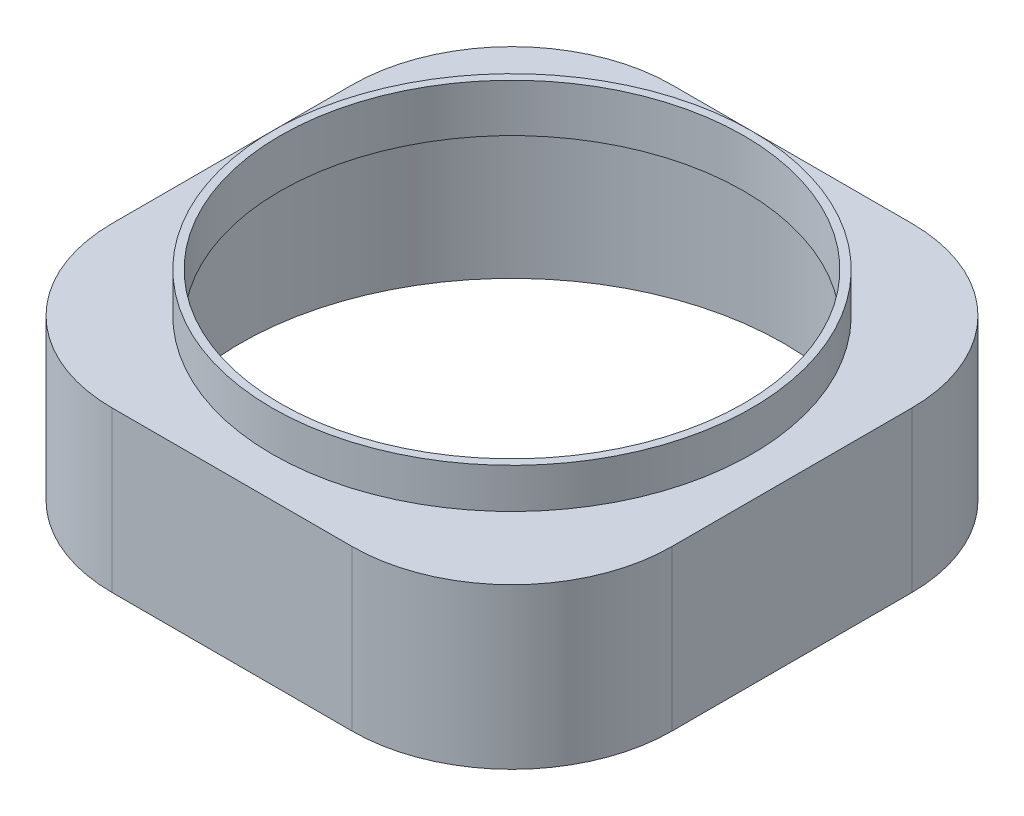
ISO-10303-21;
HEADER;
FILE_DESCRIPTION(('STEP AP214'),'2;1');
FILE_NAME('part.step','',(''),(''),'','','');
FILE_SCHEMA(('AUTOMOTIVE_DESIGN { 1 0 10303 214 1 1 1 1 }'));
ENDSEC;
DATA;
#1=APPLICATION_CONTEXT('core data for automotive mechanical design processes');
#2=APPLICATION_PROTOCOL_DEFINITION('international standard','automotive_design',2000,#1);
#3=PRODUCT_CONTEXT('',#1,'mechanical');
#4=PRODUCT('Part','Part','',(#3));
#5=PRODUCT_RELATED_PRODUCT_CATEGORY('part','',(#4));
#6=PRODUCT_DEFINITION_FORMATION('','',#4);
#7=PRODUCT_DEFINITION_CONTEXT('part definition',#1,'design');
#8=PRODUCT_DEFINITION('design','',#6,#7);
#9=PRODUCT_DEFINITION_SHAPE('','',#8);
#10=(LENGTH_UNIT() NAMED_UNIT(*) SI_UNIT(.MILLI.,.METRE.));
#11=(NAMED_UNIT(*) PLANE_ANGLE_UNIT() SI_UNIT($,.RADIAN.));
#12=(NAMED_UNIT(*) SI_UNIT($,.STERADIAN.) SOLID_ANGLE_UNIT());
#13=UNCERTAINTY_MEASURE_WITH_UNIT(LENGTH_MEASURE(1.E-05),#10,'distance_accuracy_value','');
#14=(GEOMETRIC_REPRESENTATION_CONTEXT(3) GLOBAL_UNCERTAINTY_ASSIGNED_CONTEXT((#13)) GLOBAL_UNIT_ASSIGNED_CONTEXT((#10,
#11,#12)) REPRESENTATION_CONTEXT('',''));
#15=CARTESIAN_POINT('',(0.,0.,0.));
#16=DIRECTION('',(0.,0.,1.));
#17=DIRECTION('',(1.,0.,0.));
#18=AXIS2_PLACEMENT_3D('',#15,#16,#17);
#19=CARTESIAN_POINT('',(-30.,-40.,30.));
#20=DIRECTION('',(0.,1.,0.));
#21=DIRECTION('',(0.,0.,1.));
#22=AXIS2_PLACEMENT_3D('',#19,#20,#21);
#23=CYLINDRICAL_SURFACE('',#22,40.);
#24=CARTESIAN_POINT('',(-30.,0.,30.));
#25=DIRECTION('',(0.,1.,0.));
#26=DIRECTION('',(0.,0.,-1.));
#27=AXIS2_PLACEMENT_3D('',#24,#25,#26);
#28=CIRCLE('',#27,40.);
#29=CARTESIAN_POINT('',(-70.,0.,29.9999999999997));
#30=VERTEX_POINT('',#29);
#31=CARTESIAN_POINT('',(-29.9999999999997,0.,70.));
#32=VERTEX_POINT('',#31);
#33=EDGE_CURVE('E132',#30,#32,#28,.T.);
#34=ORIENTED_EDGE('',*,*,#33,.F.);
#35=DIRECTION('',(0.,1.,0.));
#36=VECTOR('',#35,1.);
#37=CARTESIAN_POINT('',(-70.,-40.,29.9999999999997));
#38=LINE('',#37,#36);
#39=CARTESIAN_POINT('',(-70.,-40.,29.9999999999997));
#40=VERTEX_POINT('',#39);
#41=EDGE_CURVE('E42',#40,#30,#38,.T.);
#42=ORIENTED_EDGE('',*,*,#41,.F.);
#43=CARTESIAN_POINT('',(-30.,-40.,30.));
#44=DIRECTION('',(0.,1.,0.));
#45=DIRECTION('',(0.,0.,-1.));
#46=AXIS2_PLACEMENT_3D('',#43,#44,#45);
#47=CIRCLE('',#46,40.);
#48=CARTESIAN_POINT('',(-29.9999999999997,-40.,70.));
#49=VERTEX_POINT('',#48);
#50=EDGE_CURVE('E154',#40,#49,#47,.T.);
#51=ORIENTED_EDGE('',*,*,#50,.T.);
#52=DIRECTION('',(0.,1.,0.));
#53=VECTOR('',#52,1.);
#54=CARTESIAN_POINT('',(-29.9999999999997,-40.,70.));
#55=LINE('',#54,#53);
#56=EDGE_CURVE('E36',#49,#32,#55,.T.);
#57=ORIENTED_EDGE('',*,*,#56,.T.);
#58=EDGE_LOOP('',(#34,#42,#51,#57));
#59=FACE_BOUND('',#58,.T.);
#60=ADVANCED_FACE('F33',(#59),#23,.T.);
#61=CARTESIAN_POINT('',(-70.,-40.,-29.9999999999997));
#62=DIRECTION('',(-1.,0.,0.));
#63=DIRECTION('',(0.,0.,1.));
#64=AXIS2_PLACEMENT_3D('',#61,#62,#63);
#65=PLANE('',#64);
#66=DIRECTION('',(0.,0.,1.));
#67=VECTOR('',#66,1.);
#68=CARTESIAN_POINT('',(-70.,0.,-29.9999999999997));
#69=LINE('',#68,#67);
#70=CARTESIAN_POINT('',(-70.,0.,-29.9999999999997));
#71=VERTEX_POINT('',#70);
#72=EDGE_CURVE('E151',#71,#30,#69,.T.);
#73=ORIENTED_EDGE('',*,*,#72,.F.);
#74=DIRECTION('',(0.,1.,0.));
#75=VECTOR('',#74,1.);
#76=CARTESIAN_POINT('',(-70.,-40.,-29.9999999999997));
#77=LINE('',#76,#75);
#78=CARTESIAN_POINT('',(-70.,-40.,-29.9999999999997));
#79=VERTEX_POINT('',#78);
#80=EDGE_CURVE('E79',#79,#71,#77,.T.);
#81=ORIENTED_EDGE('',*,*,#80,.F.);
#82=DIRECTION('',(0.,0.,1.));
#83=VECTOR('',#82,1.);
#84=CARTESIAN_POINT('',(-70.,-40.,-29.9999999999997));
#85=LINE('',#84,#83);
#86=EDGE_CURVE('E122',#79,#40,#85,.T.);
#87=ORIENTED_EDGE('',*,*,#86,.T.);
#88=ORIENTED_EDGE('',*,*,#41,.T.);
#89=EDGE_LOOP('',(#73,#81,#87,#88));
#90=FACE_BOUND('',#89,.T.);
#91=ADVANCED_FACE('F166',(#90),#65,.T.);
#92=CARTESIAN_POINT('',(-30.,-40.,-30.));
#93=DIRECTION('',(0.,1.,0.));
#94=DIRECTION('',(0.,0.,1.));
#95=AXIS2_PLACEMENT_3D('',#92,#93,#94);
#96=CYLINDRICAL_SURFACE('',#95,40.);
#97=CARTESIAN_POINT('',(-30.,0.,-30.));
#98=DIRECTION('',(0.,1.,0.));
#99=DIRECTION('',(0.,0.,-1.));
#100=AXIS2_PLACEMENT_3D('',#97,#98,#99);
#101=CIRCLE('',#100,40.);
#102=CARTESIAN_POINT('',(-29.9999999999997,0.,-70.));
#103=VERTEX_POINT('',#102);
#104=EDGE_CURVE('E109',#103,#71,#101,.T.);
#105=ORIENTED_EDGE('',*,*,#104,.F.);
#106=DIRECTION('',(0.,1.,0.));
#107=VECTOR('',#106,1.);
#108=CARTESIAN_POINT('',(-29.9999999999997,-40.,-70.));
#109=LINE('',#108,#107);
#110=CARTESIAN_POINT('',(-29.9999999999997,-40.,-70.));
#111=VERTEX_POINT('',#110);
#112=EDGE_CURVE('E104',#111,#103,#109,.T.);
#113=ORIENTED_EDGE('',*,*,#112,.F.);
#114=CARTESIAN_POINT('',(-30.,-40.,-30.));
#115=DIRECTION('',(0.,1.,0.));
#116=DIRECTION('',(0.,0.,-1.));
#117=AXIS2_PLACEMENT_3D('',#114,#115,#116);
#118=CIRCLE('',#117,40.);
#119=EDGE_CURVE('E107',#111,#79,#118,.T.);
#120=ORIENTED_EDGE('',*,*,#119,.T.);
#121=ORIENTED_EDGE('',*,*,#80,.T.);
#122=EDGE_LOOP('',(#105,#113,#120,#121));
#123=FACE_BOUND('',#122,.T.);
#124=ADVANCED_FACE('F106',(#123),#96,.T.);
#125=CARTESIAN_POINT('',(-29.9999999999997,-40.,-70.));
#126=DIRECTION('',(0.,0.,-1.));
#127=DIRECTION('',(-1.,0.,0.));
#128=AXIS2_PLACEMENT_3D('',#125,#126,#127);
#129=PLANE('',#128);
#130=DIRECTION('',(-1.,0.,0.));
#131=VECTOR('',#130,1.);
#132=CARTESIAN_POINT('',(-29.9999999999997,0.,-70.));
#133=LINE('',#132,#131);
#134=CARTESIAN_POINT('',(29.9999999999997,0.,-70.));
#135=VERTEX_POINT('',#134);
#136=EDGE_CURVE('E148',#135,#103,#133,.T.);
#137=ORIENTED_EDGE('',*,*,#136,.F.);
#138=DIRECTION('',(0.,1.,0.));
#139=VECTOR('',#138,1.);
#140=CARTESIAN_POINT('',(29.9999999999997,-40.,-70.));
#141=LINE('',#140,#139);
#142=CARTESIAN_POINT('',(29.9999999999997,-40.,-70.));
#143=VERTEX_POINT('',#142);
#144=EDGE_CURVE('E114',#143,#135,#141,.T.);
#145=ORIENTED_EDGE('',*,*,#144,.F.);
#146=DIRECTION('',(-1.,0.,0.));
#147=VECTOR('',#146,1.);
#148=CARTESIAN_POINT('',(-29.9999999999997,-40.,-70.));
#149=LINE('',#148,#147);
#150=EDGE_CURVE('E120',#143,#111,#149,.T.);
#151=ORIENTED_EDGE('',*,*,#150,.T.);
#152=ORIENTED_EDGE('',*,*,#112,.T.);
#153=EDGE_LOOP('',(#137,#145,#151,#152));
#154=FACE_BOUND('',#153,.T.);
#155=ADVANCED_FACE('F124',(#154),#129,.T.);
#156=CARTESIAN_POINT('',(30.,-40.,-30.));
#157=DIRECTION('',(0.,1.,0.));
#158=DIRECTION('',(0.,0.,1.));
#159=AXIS2_PLACEMENT_3D('',#156,#157,#158);
#160=CYLINDRICAL_SURFACE('',#159,40.);
#161=CARTESIAN_POINT('',(30.,0.,-30.));
#162=DIRECTION('',(0.,1.,0.));
#163=DIRECTION('',(0.,0.,1.));
#164=AXIS2_PLACEMENT_3D('',#161,#162,#163);
#165=CIRCLE('',#164,40.);
#166=CARTESIAN_POINT('',(70.,0.,-29.9999999999997));
#167=VERTEX_POINT('',#166);
#168=EDGE_CURVE('E145',#167,#135,#165,.T.);
#169=ORIENTED_EDGE('',*,*,#168,.F.);
#170=DIRECTION('',(0.,1.,0.));
#171=VECTOR('',#170,1.);
#172=CARTESIAN_POINT('',(70.,-40.,-29.9999999999997));
#173=LINE('',#172,#171);
#174=CARTESIAN_POINT('',(70.,-40.,-29.9999999999997));
#175=VERTEX_POINT('',#174);
#176=EDGE_CURVE('E158',#175,#167,#173,.T.);
#177=ORIENTED_EDGE('',*,*,#176,.F.);
#178=CARTESIAN_POINT('',(30.,-40.,-30.));
#179=DIRECTION('',(0.,1.,0.));
#180=DIRECTION('',(0.,0.,1.));
#181=AXIS2_PLACEMENT_3D('',#178,#179,#180);
#182=CIRCLE('',#181,40.);
#183=EDGE_CURVE('E125',#175,#143,#182,.T.);
#184=ORIENTED_EDGE('',*,*,#183,.T.);
#185=ORIENTED_EDGE('',*,*,#144,.T.);
#186=EDGE_LOOP('',(#169,#177,#184,#185));
#187=FACE_BOUND('',#186,.T.);
#188=ADVANCED_FACE('F179',(#187),#160,.T.);
#189=CARTESIAN_POINT('',(70.,-40.,-29.9999999999997));
#190=DIRECTION('',(1.,0.,0.));
#191=DIRECTION('',(0.,0.,-1.));
#192=AXIS2_PLACEMENT_3D('',#189,#190,#191);
#193=PLANE('',#192);
#194=DIRECTION('',(0.,0.,-1.));
#195=VECTOR('',#194,1.);
#196=CARTESIAN_POINT('',(70.,0.,-29.9999999999997));
#197=LINE('',#196,#195);
#198=CARTESIAN_POINT('',(70.,0.,29.9999999999997));
#199=VERTEX_POINT('',#198);
#200=EDGE_CURVE('E142',#199,#167,#197,.T.);
#201=ORIENTED_EDGE('',*,*,#200,.F.);
#202=DIRECTION('',(0.,1.,0.));
#203=VECTOR('',#202,1.);
#204=CARTESIAN_POINT('',(70.,-40.,29.9999999999997));
#205=LINE('',#204,#203);
#206=CARTESIAN_POINT('',(70.,-40.,29.9999999999997));
#207=VERTEX_POINT('',#206);
#208=EDGE_CURVE('E160',#207,#199,#205,.T.);
#209=ORIENTED_EDGE('',*,*,#208,.F.);
#210=DIRECTION('',(0.,0.,-1.));
#211=VECTOR('',#210,1.);
#212=CARTESIAN_POINT('',(70.,-40.,-29.9999999999997));
#213=LINE('',#212,#211);
#214=EDGE_CURVE('E127',#207,#175,#213,.T.);
#215=ORIENTED_EDGE('',*,*,#214,.T.);
#216=ORIENTED_EDGE('',*,*,#176,.T.);
#217=EDGE_LOOP('',(#201,#209,#215,#216));
#218=FACE_BOUND('',#217,.T.);
#219=ADVANCED_FACE('F182',(#218),#193,.T.);
#220=CARTESIAN_POINT('',(30.,-40.,30.));
#221=DIRECTION('',(0.,1.,0.));
#222=DIRECTION('',(0.,0.,1.));
#223=AXIS2_PLACEMENT_3D('',#220,#221,#222);
#224=CYLINDRICAL_SURFACE('',#223,40.);
#225=CARTESIAN_POINT('',(30.,0.,30.));
#226=DIRECTION('',(0.,1.,0.));
#227=DIRECTION('',(0.,0.,1.));
#228=AXIS2_PLACEMENT_3D('',#225,#226,#227);
#229=CIRCLE('',#228,40.);
#230=CARTESIAN_POINT('',(29.9999999999997,0.,70.));
#231=VERTEX_POINT('',#230);
#232=EDGE_CURVE('E139',#231,#199,#229,.T.);
#233=ORIENTED_EDGE('',*,*,#232,.F.);
#234=DIRECTION('',(0.,1.,0.));
#235=VECTOR('',#234,1.);
#236=CARTESIAN_POINT('',(29.9999999999997,-40.,70.));
#237=LINE('',#236,#235);
#238=CARTESIAN_POINT('',(29.9999999999997,-40.,70.));
#239=VERTEX_POINT('',#238);
#240=EDGE_CURVE('E161',#239,#231,#237,.T.);
#241=ORIENTED_EDGE('',*,*,#240,.F.);
#242=CARTESIAN_POINT('',(30.,-40.,30.));
#243=DIRECTION('',(0.,1.,0.));
#244=DIRECTION('',(0.,0.,1.));
#245=AXIS2_PLACEMENT_3D('',#242,#243,#244);
#246=CIRCLE('',#245,40.);
#247=EDGE_CURVE('E242',#239,#207,#246,.T.);
#248=ORIENTED_EDGE('',*,*,#247,.T.);
#249=ORIENTED_EDGE('',*,*,#208,.T.);
#250=EDGE_LOOP('',(#233,#241,#248,#249));
#251=FACE_BOUND('',#250,.T.);
#252=ADVANCED_FACE('F186',(#251),#224,.T.);
#253=CARTESIAN_POINT('',(-29.9999999999997,-40.,70.));
#254=DIRECTION('',(0.,0.,1.));
#255=DIRECTION('',(1.,0.,0.));
#256=AXIS2_PLACEMENT_3D('',#253,#254,#255);
#257=PLANE('',#256);
#258=DIRECTION('',(1.,0.,0.));
#259=VECTOR('',#258,1.);
#260=CARTESIAN_POINT('',(-29.9999999999997,0.,70.));
#261=LINE('',#260,#259);
#262=EDGE_CURVE('E135',#32,#231,#261,.T.);
#263=ORIENTED_EDGE('',*,*,#262,.F.);
#264=ORIENTED_EDGE('',*,*,#56,.F.);
#265=DIRECTION('',(1.,0.,0.));
#266=VECTOR('',#265,1.);
#267=CARTESIAN_POINT('',(-29.9999999999997,-40.,70.));
#268=LINE('',#267,#266);
#269=EDGE_CURVE('E240',#49,#239,#268,.T.);
#270=ORIENTED_EDGE('',*,*,#269,.T.);
#271=ORIENTED_EDGE('',*,*,#240,.T.);
#272=EDGE_LOOP('',(#263,#264,#270,#271));
#273=FACE_BOUND('',#272,.T.);
#274=ADVANCED_FACE('F163',(#273),#257,.T.);
#275=CARTESIAN_POINT('',(-30.,-40.,30.));
#276=DIRECTION('',(0.,-1.,0.));
#277=DIRECTION('',(0.,0.,-1.));
#278=AXIS2_PLACEMENT_3D('',#275,#276,#277);
#279=PLANE('',#278);
#280=CARTESIAN_POINT('',(0.,-40.,0.));
#281=DIRECTION('',(0.,-1.,0.));
#282=DIRECTION('',(0.,0.,-1.));
#283=AXIS2_PLACEMENT_3D('',#280,#281,#282);
#284=CIRCLE('',#283,68.);
#285=CARTESIAN_POINT('',(0.,-40.,-68.));
#286=VERTEX_POINT('',#285);
#287=EDGE_CURVE('E233',#286,#286,#284,.T.);
#288=ORIENTED_EDGE('',*,*,#287,.F.);
#289=EDGE_LOOP('',(#288));
#290=FACE_BOUND('',#289,.T.);
#291=ORIENTED_EDGE('',*,*,#50,.F.);
#292=ORIENTED_EDGE('',*,*,#86,.F.);
#293=ORIENTED_EDGE('',*,*,#119,.F.);
#294=ORIENTED_EDGE('',*,*,#150,.F.);
#295=ORIENTED_EDGE('',*,*,#183,.F.);
#296=ORIENTED_EDGE('',*,*,#214,.F.);
#297=ORIENTED_EDGE('',*,*,#247,.F.);
#298=ORIENTED_EDGE('',*,*,#269,.F.);
#299=EDGE_LOOP('',(#291,#292,#293,#294,#295,#296,#297,#298));
#300=FACE_BOUND('',#299,.T.);
#301=ADVANCED_FACE('F118',(#290,#300),#279,.T.);
#302=CARTESIAN_POINT('',(-30.,0.,30.));
#303=DIRECTION('',(0.,-1.,0.));
#304=DIRECTION('',(0.,0.,-1.));
#305=AXIS2_PLACEMENT_3D('',#302,#303,#304);
#306=PLANE('',#305);
#307=CARTESIAN_POINT('',(0.,0.,0.));
#308=DIRECTION('',(0.,1.,0.));
#309=DIRECTION('',(0.,0.,1.));
#310=AXIS2_PLACEMENT_3D('',#307,#308,#309);
#311=CIRCLE('',#310,60.);
#312=CARTESIAN_POINT('',(0.,0.,60.));
#313=VERTEX_POINT('',#312);
#314=EDGE_CURVE('E11',#313,#313,#311,.T.);
#315=ORIENTED_EDGE('',*,*,#314,.F.);
#316=EDGE_LOOP('',(#315));
#317=FACE_BOUND('',#316,.T.);
#318=ORIENTED_EDGE('',*,*,#33,.T.);
#319=ORIENTED_EDGE('',*,*,#262,.T.);
#320=ORIENTED_EDGE('',*,*,#232,.T.);
#321=ORIENTED_EDGE('',*,*,#200,.T.);
#322=ORIENTED_EDGE('',*,*,#168,.T.);
#323=ORIENTED_EDGE('',*,*,#136,.T.);
#324=ORIENTED_EDGE('',*,*,#104,.T.);
#325=ORIENTED_EDGE('',*,*,#72,.T.);
#326=EDGE_LOOP('',(#318,#319,#320,#321,#322,#323,#324,#325));
#327=FACE_BOUND('',#326,.T.);
#328=ADVANCED_FACE('F165',(#317,#327),#306,.F.);
#329=CARTESIAN_POINT('',(0.,9.99999999999997,0.));
#330=DIRECTION('',(0.,-1.,0.));
#331=DIRECTION('',(0.,0.,-1.));
#332=AXIS2_PLACEMENT_3D('',#329,#330,#331);
#333=CYLINDRICAL_SURFACE('',#332,60.);
#334=CARTESIAN_POINT('',(0.,9.99999999999997,0.));
#335=DIRECTION('',(0.,1.,0.));
#336=DIRECTION('',(0.,0.,1.));
#337=AXIS2_PLACEMENT_3D('',#334,#335,#336);
#338=CIRCLE('',#337,60.);
#339=CARTESIAN_POINT('',(0.,9.99999999999997,60.));
#340=VERTEX_POINT('',#339);
#341=EDGE_CURVE('E136',#340,#340,#338,.T.);
#342=ORIENTED_EDGE('',*,*,#341,.F.);
#343=EDGE_LOOP('',(#342));
#344=FACE_BOUND('',#343,.T.);
#345=ORIENTED_EDGE('',*,*,#314,.T.);
#346=EDGE_LOOP('',(#345));
#347=FACE_BOUND('',#346,.T.);
#348=ADVANCED_FACE('F198',(#344,#347),#333,.T.);
#349=CARTESIAN_POINT('',(0.,9.99999999999997,0.));
#350=DIRECTION('',(0.,1.,0.));
#351=DIRECTION('',(0.,0.,1.));
#352=AXIS2_PLACEMENT_3D('',#349,#350,#351);
#353=PLANE('',#352);
#354=CARTESIAN_POINT('',(0.,9.99999999999997,0.));
#355=DIRECTION('',(0.,1.,0.));
#356=DIRECTION('',(0.,0.,1.));
#357=AXIS2_PLACEMENT_3D('',#354,#355,#356);
#358=CIRCLE('',#357,58.);
#359=CARTESIAN_POINT('',(0.,9.99999999999997,58.));
#360=VERTEX_POINT('',#359);
#361=EDGE_CURVE('E229',#360,#360,#358,.T.);
#362=ORIENTED_EDGE('',*,*,#361,.F.);
#363=EDGE_LOOP('',(#362));
#364=FACE_BOUND('',#363,.T.);
#365=ORIENTED_EDGE('',*,*,#341,.T.);
#366=EDGE_LOOP('',(#365));
#367=FACE_BOUND('',#366,.T.);
#368=ADVANCED_FACE('F204',(#364,#367),#353,.T.);
#369=CARTESIAN_POINT('',(0.,-1.99999999999997,0.));
#370=DIRECTION('',(0.,1.,0.));
#371=DIRECTION('',(0.,0.,1.));
#372=AXIS2_PLACEMENT_3D('',#369,#370,#371);
#373=CYLINDRICAL_SURFACE('',#372,58.);
#374=CARTESIAN_POINT('',(0.,-1.99999999999997,0.));
#375=DIRECTION('',(0.,1.,0.));
#376=DIRECTION('',(0.,0.,1.));
#377=AXIS2_PLACEMENT_3D('',#374,#375,#376);
#378=CIRCLE('',#377,58.);
#379=CARTESIAN_POINT('',(0.,-1.99999999999997,58.));
#380=VERTEX_POINT('',#379);
#381=EDGE_CURVE('E228',#380,#380,#378,.T.);
#382=ORIENTED_EDGE('',*,*,#381,.F.);
#383=EDGE_LOOP('',(#382));
#384=FACE_BOUND('',#383,.T.);
#385=ORIENTED_EDGE('',*,*,#361,.T.);
#386=EDGE_LOOP('',(#385));
#387=FACE_BOUND('',#386,.T.);
#388=ADVANCED_FACE('F208',(#384,#387),#373,.F.);
#389=CARTESIAN_POINT('',(0.,-2.00000000000007,0.));
#390=DIRECTION('',(0.,-1.,0.));
#391=DIRECTION('',(0.,0.,-1.));
#392=AXIS2_PLACEMENT_3D('',#389,#390,#391);
#393=PLANE('',#392);
#394=CARTESIAN_POINT('',(0.,-2.00000000000007,0.));
#395=DIRECTION('',(0.,-1.,0.));
#396=DIRECTION('',(0.,0.,-1.));
#397=AXIS2_PLACEMENT_3D('',#394,#395,#396);
#398=CIRCLE('',#397,68.);
#399=CARTESIAN_POINT('',(0.,-2.00000000000007,-68.));
#400=VERTEX_POINT('',#399);
#401=EDGE_CURVE('E225',#400,#400,#398,.T.);
#402=ORIENTED_EDGE('',*,*,#401,.T.);
#403=EDGE_LOOP('',(#402));
#404=FACE_BOUND('',#403,.T.);
#405=ORIENTED_EDGE('',*,*,#381,.T.);
#406=EDGE_LOOP('',(#405));
#407=FACE_BOUND('',#406,.T.);
#408=ADVANCED_FACE('F212',(#404,#407),#393,.T.);
#409=CARTESIAN_POINT('',(0.,-2.00000000000007,0.));
#410=DIRECTION('',(0.,-1.,0.));
#411=DIRECTION('',(0.,0.,-1.));
#412=AXIS2_PLACEMENT_3D('',#409,#410,#411);
#413=CYLINDRICAL_SURFACE('',#412,68.);
#414=ORIENTED_EDGE('',*,*,#401,.F.);
#415=EDGE_LOOP('',(#414));
#416=FACE_BOUND('',#415,.T.);
#417=ORIENTED_EDGE('',*,*,#287,.T.);
#418=EDGE_LOOP('',(#417));
#419=FACE_BOUND('',#418,.T.);
#420=ADVANCED_FACE('F214',(#416,#419),#413,.F.);
#421=CLOSED_SHELL('',(#60,#91,#124,#155,#188,#219,#252,#274,#301,#328,#348,#368,#388,#408,#420));
#422=MANIFOLD_SOLID_BREP('B2',#421);
#423=ADVANCED_BREP_SHAPE_REPRESENTATION('',(#18,#422),#14);
#424=SHAPE_DEFINITION_REPRESENTATION(#9,#423);
ENDSEC;
END-ISO-10303-21;
